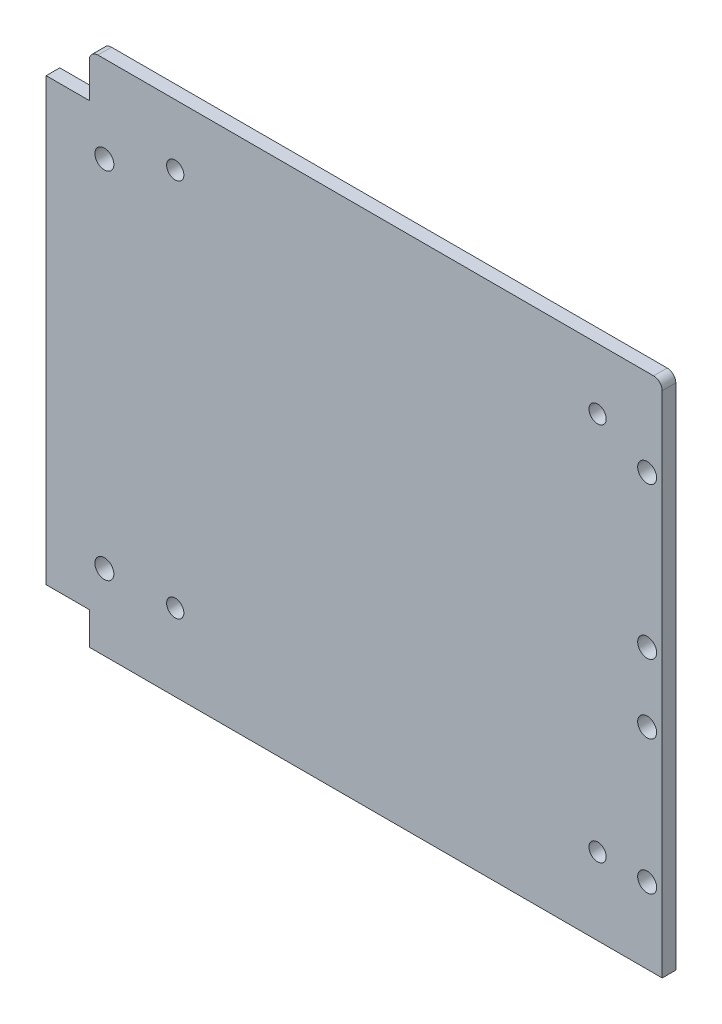
ISO-10303-21;
HEADER;
FILE_DESCRIPTION(('STEP AP214'),'2;1');
FILE_NAME('part.step','',(''),(''),'','','');
FILE_SCHEMA(('AUTOMOTIVE_DESIGN { 1 0 10303 214 1 1 1 1 }'));
ENDSEC;
DATA;
#1=APPLICATION_CONTEXT('core data for automotive mechanical design processes');
#2=APPLICATION_PROTOCOL_DEFINITION('international standard','automotive_design',2000,#1);
#3=PRODUCT_CONTEXT('',#1,'mechanical');
#4=PRODUCT('Part','Part','',(#3));
#5=PRODUCT_RELATED_PRODUCT_CATEGORY('part','',(#4));
#6=PRODUCT_DEFINITION_FORMATION('','',#4);
#7=PRODUCT_DEFINITION_CONTEXT('part definition',#1,'design');
#8=PRODUCT_DEFINITION('design','',#6,#7);
#9=PRODUCT_DEFINITION_SHAPE('','',#8);
#10=(LENGTH_UNIT() NAMED_UNIT(*) SI_UNIT(.MILLI.,.METRE.));
#11=(NAMED_UNIT(*) PLANE_ANGLE_UNIT() SI_UNIT($,.RADIAN.));
#12=(NAMED_UNIT(*) SI_UNIT($,.STERADIAN.) SOLID_ANGLE_UNIT());
#13=UNCERTAINTY_MEASURE_WITH_UNIT(LENGTH_MEASURE(1.E-05),#10,'distance_accuracy_value','');
#14=(GEOMETRIC_REPRESENTATION_CONTEXT(3) GLOBAL_UNCERTAINTY_ASSIGNED_CONTEXT((#13)) GLOBAL_UNIT_ASSIGNED_CONTEXT((#10,
#11,#12)) REPRESENTATION_CONTEXT('',''));
#15=CARTESIAN_POINT('',(0.,0.,0.));
#16=DIRECTION('',(0.,0.,1.));
#17=DIRECTION('',(1.,0.,0.));
#18=AXIS2_PLACEMENT_3D('',#15,#16,#17);
#19=CARTESIAN_POINT('',(55.5709843246072,66.3175639793119,-1.5748));
#20=DIRECTION('',(-1.,0.,0.));
#21=DIRECTION('',(0.,-1.,0.));
#22=AXIS2_PLACEMENT_3D('',#19,#20,#21);
#23=PLANE('',#22);
#24=DIRECTION('',(0.,-1.,0.));
#25=VECTOR('',#24,1.);
#26=CARTESIAN_POINT('',(55.5709843246072,66.3175639793119,-1.5748));
#27=LINE('',#26,#25);
#28=CARTESIAN_POINT('',(55.5709843246072,66.3175639793119,-1.5748));
#29=VERTEX_POINT('',#28);
#30=CARTESIAN_POINT('',(55.5709843246124,62.2425639793113,-1.5748));
#31=VERTEX_POINT('',#30);
#32=EDGE_CURVE('E265',#29,#31,#27,.T.);
#33=ORIENTED_EDGE('',*,*,#32,.T.);
#34=DIRECTION('',(0.,0.,1.));
#35=VECTOR('',#34,1.);
#36=CARTESIAN_POINT('',(55.5709843246124,62.2425639793113,-1.575));
#37=LINE('',#36,#35);
#38=CARTESIAN_POINT('',(55.5709843246124,62.2425639793113,0.));
#39=VERTEX_POINT('',#38);
#40=EDGE_CURVE('E145',#31,#39,#37,.T.);
#41=ORIENTED_EDGE('',*,*,#40,.T.);
#42=DIRECTION('',(0.,-1.,0.));
#43=VECTOR('',#42,1.);
#44=CARTESIAN_POINT('',(55.5709843246072,66.3175639793119,0.));
#45=LINE('',#44,#43);
#46=CARTESIAN_POINT('',(55.5709843246072,66.3175639793119,0.));
#47=VERTEX_POINT('',#46);
#48=EDGE_CURVE('E255',#47,#39,#45,.T.);
#49=ORIENTED_EDGE('',*,*,#48,.F.);
#50=DIRECTION('',(0.,0.,1.));
#51=VECTOR('',#50,1.);
#52=CARTESIAN_POINT('',(55.5709843246072,66.3175639793119,-1.5748));
#53=LINE('',#52,#51);
#54=EDGE_CURVE('E11',#29,#47,#53,.T.);
#55=ORIENTED_EDGE('',*,*,#54,.F.);
#56=EDGE_LOOP('',(#33,#41,#49,#55));
#57=FACE_BOUND('',#56,.T.);
#58=ADVANCED_FACE('F37',(#57),#23,.T.);
#59=DIRECTION('',(0.,0.,1.));
#60=VECTOR('',#59,1.);
#61=CARTESIAN_POINT('',(55.5709843246124,11.0925639793078,-1.575));
#62=LINE('',#61,#60);
#63=CARTESIAN_POINT('',(55.5709843246124,11.0925639793078,-1.5748));
#64=VERTEX_POINT('',#63);
#65=CARTESIAN_POINT('',(55.5709843246072,11.0925639793078,0.));
#66=VERTEX_POINT('',#65);
#67=EDGE_CURVE('E146',#64,#66,#62,.T.);
#68=ORIENTED_EDGE('',*,*,#67,.F.);
#69=CARTESIAN_POINT('',(55.5709843246072,10.9923471994021,-1.5748));
#70=VERTEX_POINT('',#69);
#71=EDGE_CURVE('E264',#64,#70,#27,.T.);
#72=ORIENTED_EDGE('',*,*,#71,.T.);
#73=DIRECTION('',(0.,0.,1.));
#74=VECTOR('',#73,1.);
#75=CARTESIAN_POINT('',(55.5709843246072,10.9923471994021,-1.575));
#76=LINE('',#75,#74);
#77=CARTESIAN_POINT('',(55.5709843246072,10.9923471994021,-1.575));
#78=VERTEX_POINT('',#77);
#79=EDGE_CURVE('E243',#78,#70,#76,.T.);
#80=ORIENTED_EDGE('',*,*,#79,.F.);
#81=DIRECTION('',(0.,-1.,0.));
#82=VECTOR('',#81,1.);
#83=CARTESIAN_POINT('',(55.5709843246072,6.81756397931188,-1.575));
#84=LINE('',#83,#82);
#85=CARTESIAN_POINT('',(55.5709843246072,7.31756397931188,-1.575));
#86=VERTEX_POINT('',#85);
#87=EDGE_CURVE('E233',#78,#86,#84,.T.);
#88=ORIENTED_EDGE('',*,*,#87,.T.);
#89=DIRECTION('',(0.,0.,1.));
#90=VECTOR('',#89,1.);
#91=CARTESIAN_POINT('',(55.5709843246072,7.31756397931188,-1.575));
#92=LINE('',#91,#90);
#93=CARTESIAN_POINT('',(55.5709843246072,7.31756397931188,0.));
#94=VERTEX_POINT('',#93);
#95=EDGE_CURVE('E62',#86,#94,#92,.T.);
#96=ORIENTED_EDGE('',*,*,#95,.T.);
#97=EDGE_CURVE('E279',#66,#94,#45,.T.);
#98=ORIENTED_EDGE('',*,*,#97,.F.);
#99=EDGE_LOOP('',(#68,#72,#80,#88,#96,#98));
#100=FACE_BOUND('',#99,.T.);
#101=ADVANCED_FACE('F313',(#100),#23,.T.);
#102=CARTESIAN_POINT('',(56.5709843246072,66.3175639793119,-1.5748));
#103=DIRECTION('',(0.,0.,1.));
#104=DIRECTION('',(1.,0.,0.));
#105=AXIS2_PLACEMENT_3D('',#102,#103,#104);
#106=CYLINDRICAL_SURFACE('',#105,1.);
#107=CARTESIAN_POINT('',(56.5709843246072,66.3175639793119,0.));
#108=DIRECTION('',(0.,0.,1.));
#109=DIRECTION('',(1.,0.,0.));
#110=AXIS2_PLACEMENT_3D('',#107,#108,#109);
#111=CIRCLE('',#110,1.);
#112=CARTESIAN_POINT('',(56.5709843246072,67.3175639793119,0.));
#113=VERTEX_POINT('',#112);
#114=EDGE_CURVE('E276',#113,#47,#111,.T.);
#115=ORIENTED_EDGE('',*,*,#114,.F.);
#116=DIRECTION('',(0.,0.,1.));
#117=VECTOR('',#116,1.);
#118=CARTESIAN_POINT('',(56.5709843246072,67.3175639793119,-1.5748));
#119=LINE('',#118,#117);
#120=CARTESIAN_POINT('',(56.5709843246072,67.3175639793119,-1.5748));
#121=VERTEX_POINT('',#120);
#122=EDGE_CURVE('E46',#121,#113,#119,.T.);
#123=ORIENTED_EDGE('',*,*,#122,.F.);
#124=CARTESIAN_POINT('',(56.5709843246072,66.3175639793119,-1.5748));
#125=DIRECTION('',(0.,0.,1.));
#126=DIRECTION('',(1.,0.,0.));
#127=AXIS2_PLACEMENT_3D('',#124,#125,#126);
#128=CIRCLE('',#127,1.);
#129=EDGE_CURVE('E261',#121,#29,#128,.T.);
#130=ORIENTED_EDGE('',*,*,#129,.T.);
#131=ORIENTED_EDGE('',*,*,#54,.T.);
#132=EDGE_LOOP('',(#115,#123,#130,#131));
#133=FACE_BOUND('',#132,.T.);
#134=ADVANCED_FACE('F319',(#133),#106,.T.);
#135=CARTESIAN_POINT('',(56.5709843246072,67.3175639793119,-1.5748));
#136=DIRECTION('',(0.,1.,0.));
#137=DIRECTION('',(-1.,0.,0.));
#138=AXIS2_PLACEMENT_3D('',#135,#136,#137);
#139=PLANE('',#138);
#140=DIRECTION('',(-1.,0.,0.));
#141=VECTOR('',#140,1.);
#142=CARTESIAN_POINT('',(56.5709843246072,67.3175639793119,0.));
#143=LINE('',#142,#141);
#144=CARTESIAN_POINT('',(121.040984324607,67.3175639793119,0.));
#145=VERTEX_POINT('',#144);
#146=EDGE_CURVE('E273',#145,#113,#143,.T.);
#147=ORIENTED_EDGE('',*,*,#146,.F.);
#148=DIRECTION('',(0.,0.,1.));
#149=VECTOR('',#148,1.);
#150=CARTESIAN_POINT('',(121.040984324607,67.3175639793119,-1.5748));
#151=LINE('',#150,#149);
#152=CARTESIAN_POINT('',(121.040984324607,67.3175639793119,-1.5748));
#153=VERTEX_POINT('',#152);
#154=EDGE_CURVE('E283',#153,#145,#151,.T.);
#155=ORIENTED_EDGE('',*,*,#154,.F.);
#156=DIRECTION('',(-1.,0.,0.));
#157=VECTOR('',#156,1.);
#158=CARTESIAN_POINT('',(56.5709843246072,67.3175639793119,-1.5748));
#159=LINE('',#158,#157);
#160=EDGE_CURVE('E258',#153,#121,#159,.T.);
#161=ORIENTED_EDGE('',*,*,#160,.T.);
#162=ORIENTED_EDGE('',*,*,#122,.T.);
#163=EDGE_LOOP('',(#147,#155,#161,#162));
#164=FACE_BOUND('',#163,.T.);
#165=ADVANCED_FACE('F327',(#164),#139,.T.);
#166=CARTESIAN_POINT('',(121.040984324607,66.3175639793119,-1.5748));
#167=DIRECTION('',(0.,0.,1.));
#168=DIRECTION('',(1.,0.,0.));
#169=AXIS2_PLACEMENT_3D('',#166,#167,#168);
#170=CYLINDRICAL_SURFACE('',#169,1.);
#171=CARTESIAN_POINT('',(121.040984324607,66.3175639793119,0.));
#172=DIRECTION('',(0.,0.,1.));
#173=DIRECTION('',(-1.,0.,0.));
#174=AXIS2_PLACEMENT_3D('',#171,#172,#173);
#175=CIRCLE('',#174,1.);
#176=CARTESIAN_POINT('',(122.040984324607,66.3175639793119,0.));
#177=VERTEX_POINT('',#176);
#178=EDGE_CURVE('E270',#177,#145,#175,.T.);
#179=ORIENTED_EDGE('',*,*,#178,.F.);
#180=DIRECTION('',(0.,0.,1.));
#181=VECTOR('',#180,1.);
#182=CARTESIAN_POINT('',(122.040984324607,66.3175639793119,-1.5748));
#183=LINE('',#182,#181);
#184=CARTESIAN_POINT('',(122.040984324607,66.3175639793119,-1.5748));
#185=VERTEX_POINT('',#184);
#186=EDGE_CURVE('E268',#185,#177,#183,.T.);
#187=ORIENTED_EDGE('',*,*,#186,.F.);
#188=CARTESIAN_POINT('',(121.040984324607,66.3175639793119,-1.5748));
#189=DIRECTION('',(0.,0.,1.));
#190=DIRECTION('',(-1.,0.,0.));
#191=AXIS2_PLACEMENT_3D('',#188,#189,#190);
#192=CIRCLE('',#191,1.);
#193=EDGE_CURVE('E254',#185,#153,#192,.T.);
#194=ORIENTED_EDGE('',*,*,#193,.T.);
#195=ORIENTED_EDGE('',*,*,#154,.T.);
#196=EDGE_LOOP('',(#179,#187,#194,#195));
#197=FACE_BOUND('',#196,.T.);
#198=ADVANCED_FACE('F330',(#197),#170,.T.);
#199=CARTESIAN_POINT('',(122.040984324607,66.3175639793119,-1.5748));
#200=DIRECTION('',(1.,0.,0.));
#201=DIRECTION('',(0.,1.,0.));
#202=AXIS2_PLACEMENT_3D('',#199,#200,#201);
#203=PLANE('',#202);
#204=DIRECTION('',(0.,0.,1.));
#205=VECTOR('',#204,1.);
#206=CARTESIAN_POINT('',(122.040984324607,7.31756397931188,-1.575));
#207=LINE('',#206,#205);
#208=CARTESIAN_POINT('',(122.040984324607,7.31756397931188,-1.575));
#209=VERTEX_POINT('',#208);
#210=CARTESIAN_POINT('',(122.040984324607,7.31756397931188,0.));
#211=VERTEX_POINT('',#210);
#212=EDGE_CURVE('E230',#209,#211,#207,.T.);
#213=ORIENTED_EDGE('',*,*,#212,.F.);
#214=DIRECTION('',(0.,1.,0.));
#215=VECTOR('',#214,1.);
#216=CARTESIAN_POINT('',(122.040984324607,6.81756397931188,-1.575));
#217=LINE('',#216,#215);
#218=CARTESIAN_POINT('',(122.040984324607,10.9923471994021,-1.575));
#219=VERTEX_POINT('',#218);
#220=EDGE_CURVE('E237',#209,#219,#217,.T.);
#221=ORIENTED_EDGE('',*,*,#220,.T.);
#222=DIRECTION('',(0.,0.,1.));
#223=VECTOR('',#222,1.);
#224=CARTESIAN_POINT('',(122.040984324607,10.9923471994021,-1.575));
#225=LINE('',#224,#223);
#226=CARTESIAN_POINT('',(122.040984324607,10.9923471994021,-1.5748));
#227=VERTEX_POINT('',#226);
#228=EDGE_CURVE('E242',#219,#227,#225,.T.);
#229=ORIENTED_EDGE('',*,*,#228,.T.);
#230=DIRECTION('',(0.,1.,0.));
#231=VECTOR('',#230,1.);
#232=CARTESIAN_POINT('',(122.040984324607,66.3175639793119,-1.5748));
#233=LINE('',#232,#231);
#234=EDGE_CURVE('E252',#227,#185,#233,.T.);
#235=ORIENTED_EDGE('',*,*,#234,.T.);
#236=ORIENTED_EDGE('',*,*,#186,.T.);
#237=DIRECTION('',(0.,1.,0.));
#238=VECTOR('',#237,1.);
#239=CARTESIAN_POINT('',(122.040984324607,66.3175639793119,0.));
#240=LINE('',#239,#238);
#241=EDGE_CURVE('E251',#211,#177,#240,.T.);
#242=ORIENTED_EDGE('',*,*,#241,.F.);
#243=EDGE_LOOP('',(#213,#221,#229,#235,#236,#242));
#244=FACE_BOUND('',#243,.T.);
#245=ADVANCED_FACE('F39',(#244),#203,.T.);
#246=CARTESIAN_POINT('',(121.040984324607,7.81756397931188,-1.5748));
#247=DIRECTION('',(0.,0.,1.));
#248=DIRECTION('',(1.,0.,0.));
#249=AXIS2_PLACEMENT_3D('',#246,#247,#248);
#250=PLANE('',#249);
#251=CARTESIAN_POINT('',(65.5409843246072,16.2425639793119,-1.5748));
#252=DIRECTION('',(0.,0.,1.));
#253=DIRECTION('',(1.,0.,0.));
#254=AXIS2_PLACEMENT_3D('',#251,#252,#253);
#255=CIRCLE('',#254,1.);
#256=CARTESIAN_POINT('',(66.5409843246072,16.2425639793119,-1.5748));
#257=VERTEX_POINT('',#256);
#258=EDGE_CURVE('E41',#257,#257,#255,.T.);
#259=ORIENTED_EDGE('',*,*,#258,.T.);
#260=EDGE_LOOP('',(#259));
#261=FACE_BOUND('',#260,.T.);
#262=CARTESIAN_POINT('',(65.5409843246072,60.2425639793119,-1.5748));
#263=DIRECTION('',(0.,0.,1.));
#264=DIRECTION('',(1.,0.,0.));
#265=AXIS2_PLACEMENT_3D('',#262,#263,#264);
#266=CIRCLE('',#265,1.);
#267=CARTESIAN_POINT('',(66.5409843246072,60.2425639793119,-1.5748));
#268=VERTEX_POINT('',#267);
#269=EDGE_CURVE('E182',#268,#268,#266,.T.);
#270=ORIENTED_EDGE('',*,*,#269,.T.);
#271=EDGE_LOOP('',(#270));
#272=FACE_BOUND('',#271,.T.);
#273=CARTESIAN_POINT('',(114.540984324607,60.2425639793119,-1.5748));
#274=DIRECTION('',(0.,0.,1.));
#275=DIRECTION('',(1.,0.,0.));
#276=AXIS2_PLACEMENT_3D('',#273,#274,#275);
#277=CIRCLE('',#276,1.);
#278=CARTESIAN_POINT('',(115.540984324607,60.2425639793119,-1.5748));
#279=VERTEX_POINT('',#278);
#280=EDGE_CURVE('E186',#279,#279,#277,.T.);
#281=ORIENTED_EDGE('',*,*,#280,.T.);
#282=EDGE_LOOP('',(#281));
#283=FACE_BOUND('',#282,.T.);
#284=CARTESIAN_POINT('',(114.540984324607,16.2425639793119,-1.5748));
#285=DIRECTION('',(0.,0.,1.));
#286=DIRECTION('',(1.,0.,0.));
#287=AXIS2_PLACEMENT_3D('',#284,#285,#286);
#288=CIRCLE('',#287,1.);
#289=CARTESIAN_POINT('',(115.540984324607,16.2425639793119,-1.5748));
#290=VERTEX_POINT('',#289);
#291=EDGE_CURVE('E190',#290,#290,#288,.T.);
#292=ORIENTED_EDGE('',*,*,#291,.T.);
#293=EDGE_LOOP('',(#292));
#294=FACE_BOUND('',#293,.T.);
#295=CARTESIAN_POINT('',(120.290984324607,16.0925639793119,-1.5748));
#296=DIRECTION('',(0.,0.,1.));
#297=DIRECTION('',(1.,0.,0.));
#298=AXIS2_PLACEMENT_3D('',#295,#296,#297);
#299=CIRCLE('',#298,1.09999999999999);
#300=CARTESIAN_POINT('',(121.390984324607,16.0925639793119,-1.5748));
#301=VERTEX_POINT('',#300);
#302=EDGE_CURVE('E196',#301,#301,#299,.T.);
#303=ORIENTED_EDGE('',*,*,#302,.T.);
#304=EDGE_LOOP('',(#303));
#305=FACE_BOUND('',#304,.T.);
#306=CARTESIAN_POINT('',(120.290984324607,31.6675639793118,-1.5748));
#307=DIRECTION('',(0.,0.,1.));
#308=DIRECTION('',(1.,0.,0.));
#309=AXIS2_PLACEMENT_3D('',#306,#307,#308);
#310=CIRCLE('',#309,1.09999999999999);
#311=CARTESIAN_POINT('',(121.390984324607,31.6675639793118,-1.5748));
#312=VERTEX_POINT('',#311);
#313=EDGE_CURVE('E200',#312,#312,#310,.T.);
#314=ORIENTED_EDGE('',*,*,#313,.T.);
#315=EDGE_LOOP('',(#314));
#316=FACE_BOUND('',#315,.T.);
#317=CARTESIAN_POINT('',(120.290984324607,39.6675639793118,-1.5748));
#318=DIRECTION('',(0.,0.,1.));
#319=DIRECTION('',(1.,0.,0.));
#320=AXIS2_PLACEMENT_3D('',#317,#318,#319);
#321=CIRCLE('',#320,1.09999999999999);
#322=CARTESIAN_POINT('',(121.390984324607,39.6675639793118,-1.5748));
#323=VERTEX_POINT('',#322);
#324=EDGE_CURVE('E206',#323,#323,#321,.T.);
#325=ORIENTED_EDGE('',*,*,#324,.T.);
#326=EDGE_LOOP('',(#325));
#327=FACE_BOUND('',#326,.T.);
#328=CARTESIAN_POINT('',(120.290984324607,57.2425639793118,-1.5748));
#329=DIRECTION('',(0.,0.,1.));
#330=DIRECTION('',(1.,0.,0.));
#331=AXIS2_PLACEMENT_3D('',#328,#329,#330);
#332=CIRCLE('',#331,1.09999999999999);
#333=CARTESIAN_POINT('',(121.390984324607,57.2425639793118,-1.5748));
#334=VERTEX_POINT('',#333);
#335=EDGE_CURVE('E212',#334,#334,#332,.T.);
#336=ORIENTED_EDGE('',*,*,#335,.T.);
#337=EDGE_LOOP('',(#336));
#338=FACE_BOUND('',#337,.T.);
#339=CARTESIAN_POINT('',(57.3209843246071,57.2425639793118,-1.5748));
#340=DIRECTION('',(0.,0.,1.));
#341=DIRECTION('',(1.,0.,0.));
#342=AXIS2_PLACEMENT_3D('',#339,#340,#341);
#343=CIRCLE('',#342,1.09999999999999);
#344=CARTESIAN_POINT('',(58.4209843246071,57.2425639793118,-1.5748));
#345=VERTEX_POINT('',#344);
#346=EDGE_CURVE('E218',#345,#345,#343,.T.);
#347=ORIENTED_EDGE('',*,*,#346,.T.);
#348=EDGE_LOOP('',(#347));
#349=FACE_BOUND('',#348,.T.);
#350=CARTESIAN_POINT('',(57.3209843246071,16.0925639793119,-1.5748));
#351=DIRECTION('',(0.,0.,1.));
#352=DIRECTION('',(1.,0.,0.));
#353=AXIS2_PLACEMENT_3D('',#350,#351,#352);
#354=CIRCLE('',#353,1.09999999999999);
#355=CARTESIAN_POINT('',(58.4209843246071,16.0925639793119,-1.5748));
#356=VERTEX_POINT('',#355);
#357=EDGE_CURVE('E224',#356,#356,#354,.T.);
#358=ORIENTED_EDGE('',*,*,#357,.T.);
#359=EDGE_LOOP('',(#358));
#360=FACE_BOUND('',#359,.T.);
#361=ORIENTED_EDGE('',*,*,#234,.F.);
#362=DIRECTION('',(-1.,0.,0.));
#363=VECTOR('',#362,1.);
#364=CARTESIAN_POINT('',(121.040984324607,10.9923471994021,-1.5748));
#365=LINE('',#364,#363);
#366=EDGE_CURVE('E246',#227,#70,#365,.T.);
#367=ORIENTED_EDGE('',*,*,#366,.T.);
#368=ORIENTED_EDGE('',*,*,#71,.F.);
#369=DIRECTION('',(0.,1.,0.));
#370=VECTOR('',#369,1.);
#371=CARTESIAN_POINT('',(55.5709843246124,7.81756397931188,-1.5748));
#372=LINE('',#371,#370);
#373=EDGE_CURVE('E141',#64,#31,#372,.T.);
#374=ORIENTED_EDGE('',*,*,#373,.T.);
#375=ORIENTED_EDGE('',*,*,#32,.F.);
#376=ORIENTED_EDGE('',*,*,#129,.F.);
#377=ORIENTED_EDGE('',*,*,#160,.F.);
#378=ORIENTED_EDGE('',*,*,#193,.F.);
#379=EDGE_LOOP('',(#361,#367,#368,#374,#375,#376,#377,#378));
#380=FACE_BOUND('',#379,.T.);
#381=ADVANCED_FACE('F293',(#261,#272,#283,#294,#305,#316,#327,#338,#349,#360,#380),#250,.F.);
#382=CARTESIAN_POINT('',(121.040984324607,7.81756397931188,0.));
#383=DIRECTION('',(0.,0.,1.));
#384=DIRECTION('',(1.,0.,0.));
#385=AXIS2_PLACEMENT_3D('',#382,#383,#384);
#386=PLANE('',#385);
#387=CARTESIAN_POINT('',(65.5409843246072,16.2425639793119,1.43114686768087E-13));
#388=DIRECTION('',(0.,0.,-1.));
#389=DIRECTION('',(0.,1.,0.));
#390=AXIS2_PLACEMENT_3D('',#387,#388,#389);
#391=CIRCLE('',#390,1.);
#392=CARTESIAN_POINT('',(65.5409843246072,17.2425639793119,1.4318722049977E-13));
#393=VERTEX_POINT('',#392);
#394=EDGE_CURVE('E176',#393,#393,#391,.T.);
#395=ORIENTED_EDGE('',*,*,#394,.T.);
#396=EDGE_LOOP('',(#395));
#397=FACE_BOUND('',#396,.T.);
#398=CARTESIAN_POINT('',(65.5409843246072,60.2425639793119,1.45716771982052E-13));
#399=DIRECTION('',(0.,0.,-1.));
#400=DIRECTION('',(0.,1.,0.));
#401=AXIS2_PLACEMENT_3D('',#398,#399,#400);
#402=CIRCLE('',#401,1.);
#403=CARTESIAN_POINT('',(65.5409843246072,61.2425639793119,1.45789305713735E-13));
#404=VERTEX_POINT('',#403);
#405=EDGE_CURVE('E179',#404,#404,#402,.T.);
#406=ORIENTED_EDGE('',*,*,#405,.T.);
#407=EDGE_LOOP('',(#406));
#408=FACE_BOUND('',#407,.T.);
#409=CARTESIAN_POINT('',(114.540984324607,60.2425639793119,1.29236898960272E-13));
#410=DIRECTION('',(0.,0.,-1.));
#411=DIRECTION('',(0.,1.,0.));
#412=AXIS2_PLACEMENT_3D('',#409,#410,#411);
#413=CIRCLE('',#412,1.);
#414=CARTESIAN_POINT('',(114.540984324607,61.2425639793119,1.29309432691955E-13));
#415=VERTEX_POINT('',#414);
#416=EDGE_CURVE('E183',#415,#415,#413,.T.);
#417=ORIENTED_EDGE('',*,*,#416,.T.);
#418=EDGE_LOOP('',(#417));
#419=FACE_BOUND('',#418,.T.);
#420=CARTESIAN_POINT('',(114.540984324607,16.2425639793119,1.26634813746307E-13));
#421=DIRECTION('',(0.,0.,-1.));
#422=DIRECTION('',(0.,1.,0.));
#423=AXIS2_PLACEMENT_3D('',#420,#421,#422);
#424=CIRCLE('',#423,1.);
#425=CARTESIAN_POINT('',(114.540984324607,17.2425639793119,1.2670734747799E-13));
#426=VERTEX_POINT('',#425);
#427=EDGE_CURVE('E187',#426,#426,#424,.T.);
#428=ORIENTED_EDGE('',*,*,#427,.T.);
#429=EDGE_LOOP('',(#428));
#430=FACE_BOUND('',#429,.T.);
#431=CARTESIAN_POINT('',(120.290984324607,16.0925639793119,0.));
#432=DIRECTION('',(0.,0.,-1.));
#433=DIRECTION('',(0.,1.,0.));
#434=AXIS2_PLACEMENT_3D('',#431,#432,#433);
#435=CIRCLE('',#434,1.09999999999999);
#436=CARTESIAN_POINT('',(120.290984324607,17.1925639793119,0.));
#437=VERTEX_POINT('',#436);
#438=EDGE_CURVE('E193',#437,#437,#435,.T.);
#439=ORIENTED_EDGE('',*,*,#438,.T.);
#440=EDGE_LOOP('',(#439));
#441=FACE_BOUND('',#440,.T.);
#442=CARTESIAN_POINT('',(120.290984324607,31.6675639793118,0.));
#443=DIRECTION('',(0.,0.,-1.));
#444=DIRECTION('',(0.,1.,0.));
#445=AXIS2_PLACEMENT_3D('',#442,#443,#444);
#446=CIRCLE('',#445,1.09999999999999);
#447=CARTESIAN_POINT('',(120.290984324607,32.7675639793118,0.));
#448=VERTEX_POINT('',#447);
#449=EDGE_CURVE('E197',#448,#448,#446,.T.);
#450=ORIENTED_EDGE('',*,*,#449,.T.);
#451=EDGE_LOOP('',(#450));
#452=FACE_BOUND('',#451,.T.);
#453=CARTESIAN_POINT('',(120.290984324607,39.6675639793118,0.));
#454=DIRECTION('',(0.,0.,-1.));
#455=DIRECTION('',(0.,1.,0.));
#456=AXIS2_PLACEMENT_3D('',#453,#454,#455);
#457=CIRCLE('',#456,1.09999999999999);
#458=CARTESIAN_POINT('',(120.290984324607,40.7675639793118,0.));
#459=VERTEX_POINT('',#458);
#460=EDGE_CURVE('E203',#459,#459,#457,.T.);
#461=ORIENTED_EDGE('',*,*,#460,.T.);
#462=EDGE_LOOP('',(#461));
#463=FACE_BOUND('',#462,.T.);
#464=CARTESIAN_POINT('',(120.290984324607,57.2425639793118,0.));
#465=DIRECTION('',(0.,0.,-1.));
#466=DIRECTION('',(0.,1.,0.));
#467=AXIS2_PLACEMENT_3D('',#464,#465,#466);
#468=CIRCLE('',#467,1.09999999999999);
#469=CARTESIAN_POINT('',(120.290984324607,58.3425639793118,0.));
#470=VERTEX_POINT('',#469);
#471=EDGE_CURVE('E209',#470,#470,#468,.T.);
#472=ORIENTED_EDGE('',*,*,#471,.T.);
#473=EDGE_LOOP('',(#472));
#474=FACE_BOUND('',#473,.T.);
#475=CARTESIAN_POINT('',(57.3209843246071,57.2425639793118,1.24032728532342E-13));
#476=DIRECTION('',(0.,0.,-1.));
#477=DIRECTION('',(0.,1.,0.));
#478=AXIS2_PLACEMENT_3D('',#475,#476,#477);
#479=CIRCLE('',#478,1.09999999999999);
#480=CARTESIAN_POINT('',(57.3209843246071,58.3425639793118,1.24030290868726E-13));
#481=VERTEX_POINT('',#480);
#482=EDGE_CURVE('E215',#481,#481,#479,.T.);
#483=ORIENTED_EDGE('',*,*,#482,.T.);
#484=EDGE_LOOP('',(#483));
#485=FACE_BOUND('',#484,.T.);
#486=CARTESIAN_POINT('',(57.3209843246071,16.0925639793119,1.24032728532342E-13));
#487=DIRECTION('',(0.,0.,-1.));
#488=DIRECTION('',(0.,1.,0.));
#489=AXIS2_PLACEMENT_3D('',#486,#487,#488);
#490=CIRCLE('',#489,1.09999999999999);
#491=CARTESIAN_POINT('',(57.3209843246071,17.1925639793119,1.24030290868726E-13));
#492=VERTEX_POINT('',#491);
#493=EDGE_CURVE('E221',#492,#492,#490,.T.);
#494=ORIENTED_EDGE('',*,*,#493,.T.);
#495=EDGE_LOOP('',(#494));
#496=FACE_BOUND('',#495,.T.);
#497=DIRECTION('',(-1.,0.,0.));
#498=VECTOR('',#497,1.);
#499=CARTESIAN_POINT('',(55.5709843246072,7.31756397931188,0.));
#500=LINE('',#499,#498);
#501=EDGE_CURVE('E227',#211,#94,#500,.T.);
#502=ORIENTED_EDGE('',*,*,#501,.F.);
#503=ORIENTED_EDGE('',*,*,#241,.T.);
#504=ORIENTED_EDGE('',*,*,#178,.T.);
#505=ORIENTED_EDGE('',*,*,#146,.T.);
#506=ORIENTED_EDGE('',*,*,#114,.T.);
#507=ORIENTED_EDGE('',*,*,#48,.T.);
#508=DIRECTION('',(1.,0.,0.));
#509=VECTOR('',#508,1.);
#510=CARTESIAN_POINT('',(50.5709843246005,62.2425639793113,0.));
#511=LINE('',#510,#509);
#512=CARTESIAN_POINT('',(50.5709843246005,62.2425639793113,0.));
#513=VERTEX_POINT('',#512);
#514=EDGE_CURVE('E161',#513,#39,#511,.T.);
#515=ORIENTED_EDGE('',*,*,#514,.F.);
#516=DIRECTION('',(0.,1.,0.));
#517=VECTOR('',#516,1.);
#518=CARTESIAN_POINT('',(50.5709843246005,11.0925639793078,0.));
#519=LINE('',#518,#517);
#520=CARTESIAN_POINT('',(50.5709843246005,11.0925639793078,0.));
#521=VERTEX_POINT('',#520);
#522=EDGE_CURVE('E159',#521,#513,#519,.T.);
#523=ORIENTED_EDGE('',*,*,#522,.F.);
#524=DIRECTION('',(1.,0.,0.));
#525=VECTOR('',#524,1.);
#526=CARTESIAN_POINT('',(50.5709843246005,11.0925639793078,0.));
#527=LINE('',#526,#525);
#528=EDGE_CURVE('E54',#521,#66,#527,.T.);
#529=ORIENTED_EDGE('',*,*,#528,.T.);
#530=ORIENTED_EDGE('',*,*,#97,.T.);
#531=EDGE_LOOP('',(#502,#503,#504,#505,#506,#507,#515,#523,#529,#530));
#532=FACE_BOUND('',#531,.T.);
#533=ADVANCED_FACE('F323',(#397,#408,#419,#430,#441,#452,#463,#474,#485,#496,#532),#386,.T.);
#534=CARTESIAN_POINT('',(55.5709843246072,10.9923471994021,-1.575));
#535=DIRECTION('',(0.,1.,0.));
#536=DIRECTION('',(0.,0.,1.));
#537=AXIS2_PLACEMENT_3D('',#534,#535,#536);
#538=PLANE('',#537);
#539=ORIENTED_EDGE('',*,*,#366,.F.);
#540=ORIENTED_EDGE('',*,*,#228,.F.);
#541=DIRECTION('',(-1.,0.,0.));
#542=VECTOR('',#541,1.);
#543=CARTESIAN_POINT('',(55.5709843246072,10.9923471994021,-1.575));
#544=LINE('',#543,#542);
#545=EDGE_CURVE('E239',#219,#78,#544,.T.);
#546=ORIENTED_EDGE('',*,*,#545,.T.);
#547=ORIENTED_EDGE('',*,*,#79,.T.);
#548=EDGE_LOOP('',(#539,#540,#546,#547));
#549=FACE_BOUND('',#548,.T.);
#550=ADVANCED_FACE('F361',(#549),#538,.T.);
#551=CARTESIAN_POINT('',(0.,0.,-1.575));
#552=DIRECTION('',(0.,0.,-1.));
#553=DIRECTION('',(-1.,0.,0.));
#554=AXIS2_PLACEMENT_3D('',#551,#552,#553);
#555=PLANE('',#554);
#556=DIRECTION('',(-1.,0.,0.));
#557=VECTOR('',#556,1.);
#558=CARTESIAN_POINT('',(55.5709843246072,7.31756397931188,-1.575));
#559=LINE('',#558,#557);
#560=EDGE_CURVE('E228',#209,#86,#559,.T.);
#561=ORIENTED_EDGE('',*,*,#560,.T.);
#562=ORIENTED_EDGE('',*,*,#87,.F.);
#563=ORIENTED_EDGE('',*,*,#545,.F.);
#564=ORIENTED_EDGE('',*,*,#220,.F.);
#565=EDGE_LOOP('',(#561,#562,#563,#564));
#566=FACE_BOUND('',#565,.T.);
#567=ADVANCED_FACE('F365',(#566),#555,.T.);
#568=CARTESIAN_POINT('',(55.5709843246072,7.31756397931188,-1.575));
#569=DIRECTION('',(0.,1.,0.));
#570=DIRECTION('',(0.,0.,1.));
#571=AXIS2_PLACEMENT_3D('',#568,#569,#570);
#572=PLANE('',#571);
#573=ORIENTED_EDGE('',*,*,#501,.T.);
#574=ORIENTED_EDGE('',*,*,#95,.F.);
#575=ORIENTED_EDGE('',*,*,#560,.F.);
#576=ORIENTED_EDGE('',*,*,#212,.T.);
#577=EDGE_LOOP('',(#573,#574,#575,#576));
#578=FACE_BOUND('',#577,.T.);
#579=ADVANCED_FACE('F366',(#578),#572,.F.);
#580=CARTESIAN_POINT('',(57.3209843246071,16.0925639793119,-6.57479999999998));
#581=DIRECTION('',(0.,0.,-1.));
#582=DIRECTION('',(0.,1.,0.));
#583=AXIS2_PLACEMENT_3D('',#580,#581,#582);
#584=CYLINDRICAL_SURFACE('',#583,1.09999999999999);
#585=ORIENTED_EDGE('',*,*,#493,.F.);
#586=EDGE_LOOP('',(#585));
#587=FACE_BOUND('',#586,.T.);
#588=ORIENTED_EDGE('',*,*,#357,.F.);
#589=EDGE_LOOP('',(#588));
#590=FACE_BOUND('',#589,.T.);
#591=ADVANCED_FACE('F368',(#587,#590),#584,.F.);
#592=CARTESIAN_POINT('',(57.3209843246071,57.2425639793118,-6.57479999999998));
#593=DIRECTION('',(0.,0.,-1.));
#594=DIRECTION('',(0.,1.,0.));
#595=AXIS2_PLACEMENT_3D('',#592,#593,#594);
#596=CYLINDRICAL_SURFACE('',#595,1.09999999999999);
#597=ORIENTED_EDGE('',*,*,#482,.F.);
#598=EDGE_LOOP('',(#597));
#599=FACE_BOUND('',#598,.T.);
#600=ORIENTED_EDGE('',*,*,#346,.F.);
#601=EDGE_LOOP('',(#600));
#602=FACE_BOUND('',#601,.T.);
#603=ADVANCED_FACE('F374',(#599,#602),#596,.F.);
#604=CARTESIAN_POINT('',(120.290984324607,57.2425639793118,-6.5748000000001));
#605=DIRECTION('',(0.,0.,-1.));
#606=DIRECTION('',(0.,1.,0.));
#607=AXIS2_PLACEMENT_3D('',#604,#605,#606);
#608=CYLINDRICAL_SURFACE('',#607,1.09999999999999);
#609=ORIENTED_EDGE('',*,*,#471,.F.);
#610=EDGE_LOOP('',(#609));
#611=FACE_BOUND('',#610,.T.);
#612=ORIENTED_EDGE('',*,*,#335,.F.);
#613=EDGE_LOOP('',(#612));
#614=FACE_BOUND('',#613,.T.);
#615=ADVANCED_FACE('F416',(#611,#614),#608,.F.);
#616=CARTESIAN_POINT('',(120.290984324607,39.6675639793118,-6.5748000000001));
#617=DIRECTION('',(0.,0.,-1.));
#618=DIRECTION('',(0.,1.,0.));
#619=AXIS2_PLACEMENT_3D('',#616,#617,#618);
#620=CYLINDRICAL_SURFACE('',#619,1.09999999999999);
#621=ORIENTED_EDGE('',*,*,#460,.F.);
#622=EDGE_LOOP('',(#621));
#623=FACE_BOUND('',#622,.T.);
#624=ORIENTED_EDGE('',*,*,#324,.F.);
#625=EDGE_LOOP('',(#624));
#626=FACE_BOUND('',#625,.T.);
#627=ADVANCED_FACE('F422',(#623,#626),#620,.F.);
#628=CARTESIAN_POINT('',(120.290984324607,31.6675639793118,-6.5748000000001));
#629=DIRECTION('',(0.,0.,-1.));
#630=DIRECTION('',(0.,1.,0.));
#631=AXIS2_PLACEMENT_3D('',#628,#629,#630);
#632=CYLINDRICAL_SURFACE('',#631,1.09999999999999);
#633=ORIENTED_EDGE('',*,*,#449,.F.);
#634=EDGE_LOOP('',(#633));
#635=FACE_BOUND('',#634,.T.);
#636=ORIENTED_EDGE('',*,*,#313,.F.);
#637=EDGE_LOOP('',(#636));
#638=FACE_BOUND('',#637,.T.);
#639=ADVANCED_FACE('F428',(#635,#638),#632,.F.);
#640=CARTESIAN_POINT('',(120.290984324607,16.0925639793119,-6.5748000000001));
#641=DIRECTION('',(0.,0.,-1.));
#642=DIRECTION('',(0.,1.,0.));
#643=AXIS2_PLACEMENT_3D('',#640,#641,#642);
#644=CYLINDRICAL_SURFACE('',#643,1.09999999999999);
#645=ORIENTED_EDGE('',*,*,#438,.F.);
#646=EDGE_LOOP('',(#645));
#647=FACE_BOUND('',#646,.T.);
#648=ORIENTED_EDGE('',*,*,#302,.F.);
#649=EDGE_LOOP('',(#648));
#650=FACE_BOUND('',#649,.T.);
#651=ADVANCED_FACE('F432',(#647,#650),#644,.F.);
#652=CARTESIAN_POINT('',(114.540984324607,16.2425639793119,-4.6498000000001));
#653=DIRECTION('',(0.,0.,-1.));
#654=DIRECTION('',(0.,1.,0.));
#655=AXIS2_PLACEMENT_3D('',#652,#653,#654);
#656=CYLINDRICAL_SURFACE('',#655,1.);
#657=ORIENTED_EDGE('',*,*,#427,.F.);
#658=EDGE_LOOP('',(#657));
#659=FACE_BOUND('',#658,.T.);
#660=ORIENTED_EDGE('',*,*,#291,.F.);
#661=EDGE_LOOP('',(#660));
#662=FACE_BOUND('',#661,.T.);
#663=ADVANCED_FACE('F308',(#659,#662),#656,.F.);
#664=CARTESIAN_POINT('',(114.540984324607,60.2425639793119,-4.6498000000001));
#665=DIRECTION('',(0.,0.,-1.));
#666=DIRECTION('',(0.,1.,0.));
#667=AXIS2_PLACEMENT_3D('',#664,#665,#666);
#668=CYLINDRICAL_SURFACE('',#667,1.);
#669=ORIENTED_EDGE('',*,*,#416,.F.);
#670=EDGE_LOOP('',(#669));
#671=FACE_BOUND('',#670,.T.);
#672=ORIENTED_EDGE('',*,*,#280,.F.);
#673=EDGE_LOOP('',(#672));
#674=FACE_BOUND('',#673,.T.);
#675=ADVANCED_FACE('F299',(#671,#674),#668,.F.);
#676=CARTESIAN_POINT('',(65.5409843246072,60.2425639793119,-4.64980000000008));
#677=DIRECTION('',(0.,0.,-1.));
#678=DIRECTION('',(0.,1.,0.));
#679=AXIS2_PLACEMENT_3D('',#676,#677,#678);
#680=CYLINDRICAL_SURFACE('',#679,1.);
#681=ORIENTED_EDGE('',*,*,#405,.F.);
#682=EDGE_LOOP('',(#681));
#683=FACE_BOUND('',#682,.T.);
#684=ORIENTED_EDGE('',*,*,#269,.F.);
#685=EDGE_LOOP('',(#684));
#686=FACE_BOUND('',#685,.T.);
#687=ADVANCED_FACE('F296',(#683,#686),#680,.F.);
#688=CARTESIAN_POINT('',(65.5409843246072,16.2425639793119,-4.64980000000009));
#689=DIRECTION('',(0.,0.,-1.));
#690=DIRECTION('',(0.,1.,0.));
#691=AXIS2_PLACEMENT_3D('',#688,#689,#690);
#692=CYLINDRICAL_SURFACE('',#691,1.);
#693=ORIENTED_EDGE('',*,*,#394,.F.);
#694=EDGE_LOOP('',(#693));
#695=FACE_BOUND('',#694,.T.);
#696=ORIENTED_EDGE('',*,*,#258,.F.);
#697=EDGE_LOOP('',(#696));
#698=FACE_BOUND('',#697,.T.);
#699=ADVANCED_FACE('F298',(#695,#698),#692,.F.);
#700=CARTESIAN_POINT('',(55.5709843246124,11.0925639793078,-1.575));
#701=DIRECTION('',(1.,0.,0.));
#702=DIRECTION('',(0.,0.,-1.));
#703=AXIS2_PLACEMENT_3D('',#700,#701,#702);
#704=PLANE('',#703);
#705=ORIENTED_EDGE('',*,*,#373,.F.);
#706=CARTESIAN_POINT('',(55.5709843246124,11.0925639793078,-1.575));
#707=VERTEX_POINT('',#706);
#708=EDGE_CURVE('E135',#707,#64,#62,.T.);
#709=ORIENTED_EDGE('',*,*,#708,.F.);
#710=DIRECTION('',(0.,1.,0.));
#711=VECTOR('',#710,1.);
#712=CARTESIAN_POINT('',(55.5709843246124,11.0925639793078,-1.575));
#713=LINE('',#712,#711);
#714=CARTESIAN_POINT('',(55.5709843246124,62.2425639793113,-1.575));
#715=VERTEX_POINT('',#714);
#716=EDGE_CURVE('E139',#707,#715,#713,.T.);
#717=ORIENTED_EDGE('',*,*,#716,.T.);
#718=EDGE_CURVE('E173',#715,#31,#37,.T.);
#719=ORIENTED_EDGE('',*,*,#718,.T.);
#720=EDGE_LOOP('',(#705,#709,#717,#719));
#721=FACE_BOUND('',#720,.T.);
#722=ADVANCED_FACE('F137',(#721),#704,.T.);
#723=CARTESIAN_POINT('',(50.5709843246005,11.0925639793078,-1.575));
#724=DIRECTION('',(0.,-1.,0.));
#725=DIRECTION('',(0.,0.,-1.));
#726=AXIS2_PLACEMENT_3D('',#723,#724,#725);
#727=PLANE('',#726);
#728=ORIENTED_EDGE('',*,*,#528,.F.);
#729=DIRECTION('',(0.,0.,1.));
#730=VECTOR('',#729,1.);
#731=CARTESIAN_POINT('',(50.5709843246005,11.0925639793078,-1.575));
#732=LINE('',#731,#730);
#733=CARTESIAN_POINT('',(50.5709843246005,11.0925639793078,-1.575));
#734=VERTEX_POINT('',#733);
#735=EDGE_CURVE('E157',#734,#521,#732,.T.);
#736=ORIENTED_EDGE('',*,*,#735,.F.);
#737=DIRECTION('',(1.,0.,0.));
#738=VECTOR('',#737,1.);
#739=CARTESIAN_POINT('',(50.5709843246005,11.0925639793078,-1.575));
#740=LINE('',#739,#738);
#741=EDGE_CURVE('E151',#734,#707,#740,.T.);
#742=ORIENTED_EDGE('',*,*,#741,.T.);
#743=ORIENTED_EDGE('',*,*,#708,.T.);
#744=ORIENTED_EDGE('',*,*,#67,.T.);
#745=EDGE_LOOP('',(#728,#736,#742,#743,#744));
#746=FACE_BOUND('',#745,.T.);
#747=ADVANCED_FACE('F156',(#746),#727,.T.);
#748=CARTESIAN_POINT('',(50.5709843246005,11.0925639793078,-1.575));
#749=DIRECTION('',(1.,0.,0.));
#750=DIRECTION('',(0.,0.,-1.));
#751=AXIS2_PLACEMENT_3D('',#748,#749,#750);
#752=PLANE('',#751);
#753=ORIENTED_EDGE('',*,*,#522,.T.);
#754=DIRECTION('',(0.,0.,1.));
#755=VECTOR('',#754,1.);
#756=CARTESIAN_POINT('',(50.5709843246005,62.2425639793113,-1.575));
#757=LINE('',#756,#755);
#758=CARTESIAN_POINT('',(50.5709843246005,62.2425639793113,-1.575));
#759=VERTEX_POINT('',#758);
#760=EDGE_CURVE('E170',#759,#513,#757,.T.);
#761=ORIENTED_EDGE('',*,*,#760,.F.);
#762=DIRECTION('',(0.,1.,0.));
#763=VECTOR('',#762,1.);
#764=CARTESIAN_POINT('',(50.5709843246005,11.0925639793078,-1.575));
#765=LINE('',#764,#763);
#766=EDGE_CURVE('E165',#734,#759,#765,.T.);
#767=ORIENTED_EDGE('',*,*,#766,.F.);
#768=ORIENTED_EDGE('',*,*,#735,.T.);
#769=EDGE_LOOP('',(#753,#761,#767,#768));
#770=FACE_BOUND('',#769,.T.);
#771=ADVANCED_FACE('F513',(#770),#752,.F.);
#772=CARTESIAN_POINT('',(50.5709843246005,62.2425639793113,-1.575));
#773=DIRECTION('',(0.,-1.,0.));
#774=DIRECTION('',(0.,0.,-1.));
#775=AXIS2_PLACEMENT_3D('',#772,#773,#774);
#776=PLANE('',#775);
#777=ORIENTED_EDGE('',*,*,#514,.T.);
#778=ORIENTED_EDGE('',*,*,#40,.F.);
#779=ORIENTED_EDGE('',*,*,#718,.F.);
#780=DIRECTION('',(1.,0.,0.));
#781=VECTOR('',#780,1.);
#782=CARTESIAN_POINT('',(50.5709843246005,62.2425639793113,-1.575));
#783=LINE('',#782,#781);
#784=EDGE_CURVE('E153',#759,#715,#783,.T.);
#785=ORIENTED_EDGE('',*,*,#784,.F.);
#786=ORIENTED_EDGE('',*,*,#760,.T.);
#787=EDGE_LOOP('',(#777,#778,#779,#785,#786));
#788=FACE_BOUND('',#787,.T.);
#789=ADVANCED_FACE('F357',(#788),#776,.F.);
#790=CARTESIAN_POINT('',(0.,0.,-1.575));
#791=DIRECTION('',(0.,0.,1.));
#792=DIRECTION('',(1.,0.,0.));
#793=AXIS2_PLACEMENT_3D('',#790,#791,#792);
#794=PLANE('',#793);
#795=ORIENTED_EDGE('',*,*,#741,.F.);
#796=ORIENTED_EDGE('',*,*,#766,.T.);
#797=ORIENTED_EDGE('',*,*,#784,.T.);
#798=ORIENTED_EDGE('',*,*,#716,.F.);
#799=EDGE_LOOP('',(#795,#796,#797,#798));
#800=FACE_BOUND('',#799,.T.);
#801=ADVANCED_FACE('F150',(#800),#794,.F.);
#802=CLOSED_SHELL('',(#58,#101,#134,#165,#198,#245,#381,#533,#550,#567,#579,#591,#603,#615,#627,
#639,#651,#663,#675,#687,#699,#722,#747,#771,#789,#801));
#803=MANIFOLD_SOLID_BREP('B2',#802);
#804=ADVANCED_BREP_SHAPE_REPRESENTATION('',(#18,#803),#14);
#805=SHAPE_DEFINITION_REPRESENTATION(#9,#804);
ENDSEC;
END-ISO-10303-21;
